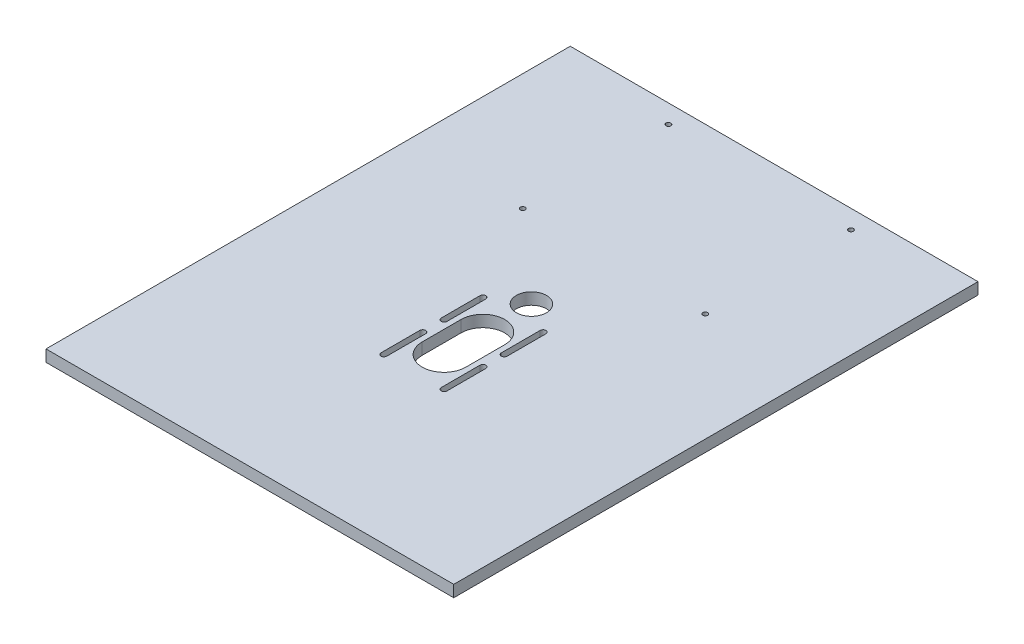
ISO-10303-21;
HEADER;
FILE_DESCRIPTION(('STEP AP214'),'2;1');
FILE_NAME('part.step','',(''),(''),'','','');
FILE_SCHEMA(('AUTOMOTIVE_DESIGN { 1 0 10303 214 1 1 1 1 }'));
ENDSEC;
DATA;
#1=APPLICATION_CONTEXT('core data for automotive mechanical design processes');
#2=APPLICATION_PROTOCOL_DEFINITION('international standard','automotive_design',2000,#1);
#3=PRODUCT_CONTEXT('',#1,'mechanical');
#4=PRODUCT('Part','Part','',(#3));
#5=PRODUCT_RELATED_PRODUCT_CATEGORY('part','',(#4));
#6=PRODUCT_DEFINITION_FORMATION('','',#4);
#7=PRODUCT_DEFINITION_CONTEXT('part definition',#1,'design');
#8=PRODUCT_DEFINITION('design','',#6,#7);
#9=PRODUCT_DEFINITION_SHAPE('','',#8);
#10=(LENGTH_UNIT() NAMED_UNIT(*) SI_UNIT(.MILLI.,.METRE.));
#11=(NAMED_UNIT(*) PLANE_ANGLE_UNIT() SI_UNIT($,.RADIAN.));
#12=(NAMED_UNIT(*) SI_UNIT($,.STERADIAN.) SOLID_ANGLE_UNIT());
#13=UNCERTAINTY_MEASURE_WITH_UNIT(LENGTH_MEASURE(1.E-05),#10,'distance_accuracy_value','');
#14=(GEOMETRIC_REPRESENTATION_CONTEXT(3) GLOBAL_UNCERTAINTY_ASSIGNED_CONTEXT((#13)) GLOBAL_UNIT_ASSIGNED_CONTEXT((#10,
#11,#12)) REPRESENTATION_CONTEXT('',''));
#15=CARTESIAN_POINT('',(0.,0.,0.));
#16=DIRECTION('',(0.,0.,1.));
#17=DIRECTION('',(1.,0.,0.));
#18=AXIS2_PLACEMENT_3D('',#15,#16,#17);
#19=CARTESIAN_POINT('',(0.,6.,0.));
#20=DIRECTION('',(0.,1.,0.));
#21=DIRECTION('',(0.,0.,1.));
#22=AXIS2_PLACEMENT_3D('',#19,#20,#21);
#23=PLANE('',#22);
#24=CARTESIAN_POINT('',(-44.8296663260453,6.,-115.382230576141));
#25=DIRECTION('',(0.,1.,0.));
#26=DIRECTION('',(0.,0.,1.));
#27=AXIS2_PLACEMENT_3D('',#24,#25,#26);
#28=CIRCLE('',#27,1.25);
#29=CARTESIAN_POINT('',(-44.8296663260453,6.,-114.132230576141));
#30=VERTEX_POINT('',#29);
#31=EDGE_CURVE('E233',#30,#30,#28,.T.);
#32=ORIENTED_EDGE('',*,*,#31,.F.);
#33=EDGE_LOOP('',(#32));
#34=FACE_BOUND('',#33,.T.);
#35=CARTESIAN_POINT('',(49.1703336739547,6.,-40.3822305761409));
#36=DIRECTION('',(0.,1.,0.));
#37=DIRECTION('',(0.,0.,1.));
#38=AXIS2_PLACEMENT_3D('',#35,#36,#37);
#39=CIRCLE('',#38,1.25);
#40=CARTESIAN_POINT('',(49.1703336739547,6.,-39.1322305761409));
#41=VERTEX_POINT('',#40);
#42=EDGE_CURVE('E545',#41,#41,#39,.T.);
#43=ORIENTED_EDGE('',*,*,#42,.F.);
#44=EDGE_LOOP('',(#43));
#45=FACE_BOUND('',#44,.T.);
#46=CARTESIAN_POINT('',(-44.8296663260453,6.,-40.3822305761409));
#47=DIRECTION('',(0.,1.,0.));
#48=DIRECTION('',(0.,0.,1.));
#49=AXIS2_PLACEMENT_3D('',#46,#47,#48);
#50=CIRCLE('',#49,1.25);
#51=CARTESIAN_POINT('',(-44.8296663260453,6.,-39.1322305761409));
#52=VERTEX_POINT('',#51);
#53=EDGE_CURVE('E525',#52,#52,#50,.T.);
#54=ORIENTED_EDGE('',*,*,#53,.F.);
#55=EDGE_LOOP('',(#54));
#56=FACE_BOUND('',#55,.T.);
#57=CARTESIAN_POINT('',(49.1703336739547,6.,-115.382230576141));
#58=DIRECTION('',(0.,1.,0.));
#59=DIRECTION('',(0.,0.,1.));
#60=AXIS2_PLACEMENT_3D('',#57,#58,#59);
#61=CIRCLE('',#60,1.25);
#62=CARTESIAN_POINT('',(49.1703336739547,6.,-114.132230576141));
#63=VERTEX_POINT('',#62);
#64=EDGE_CURVE('E541',#63,#63,#61,.T.);
#65=ORIENTED_EDGE('',*,*,#64,.F.);
#66=EDGE_LOOP('',(#65));
#67=FACE_BOUND('',#66,.T.);
#68=CARTESIAN_POINT('',(15.5000221532758,6.,60.4999999999945));
#69=DIRECTION('',(0.,1.,0.));
#70=DIRECTION('',(0.,0.,1.));
#71=AXIS2_PLACEMENT_3D('',#68,#69,#70);
#72=CIRCLE('',#71,1.49999999999999);
#73=CARTESIAN_POINT('',(14.0000221532759,6.,60.4999999999945));
#74=VERTEX_POINT('',#73);
#75=CARTESIAN_POINT('',(17.0000221532759,6.,60.4999999999945));
#76=VERTEX_POINT('',#75);
#77=EDGE_CURVE('E345',#74,#76,#72,.T.);
#78=ORIENTED_EDGE('',*,*,#77,.F.);
#79=DIRECTION('',(0.,0.,1.));
#80=VECTOR('',#79,1.);
#81=CARTESIAN_POINT('',(14.0000221532759,6.,0.));
#82=LINE('',#81,#80);
#83=CARTESIAN_POINT('',(14.0000221532759,6.,40.4999999999945));
#84=VERTEX_POINT('',#83);
#85=EDGE_CURVE('E339',#84,#74,#82,.T.);
#86=ORIENTED_EDGE('',*,*,#85,.F.);
#87=CARTESIAN_POINT('',(15.5000221532758,6.,40.4999999999945));
#88=DIRECTION('',(0.,1.,0.));
#89=DIRECTION('',(0.,0.,1.));
#90=AXIS2_PLACEMENT_3D('',#87,#88,#89);
#91=CIRCLE('',#90,1.49999999999998);
#92=CARTESIAN_POINT('',(17.0000221532759,6.,40.4999999999945));
#93=VERTEX_POINT('',#92);
#94=EDGE_CURVE('E341',#93,#84,#91,.T.);
#95=ORIENTED_EDGE('',*,*,#94,.F.);
#96=DIRECTION('',(0.,0.,-1.));
#97=VECTOR('',#96,1.);
#98=CARTESIAN_POINT('',(17.0000221532759,6.,0.));
#99=LINE('',#98,#97);
#100=EDGE_CURVE('E343',#76,#93,#99,.T.);
#101=ORIENTED_EDGE('',*,*,#100,.F.);
#102=EDGE_LOOP('',(#78,#86,#95,#101));
#103=FACE_BOUND('',#102,.T.);
#104=CARTESIAN_POINT('',(-15.4999931078622,6.,29.5000152611476));
#105=DIRECTION('',(0.,1.,0.));
#106=DIRECTION('',(0.,0.,1.));
#107=AXIS2_PLACEMENT_3D('',#104,#105,#106);
#108=CIRCLE('',#107,1.49999999999996);
#109=CARTESIAN_POINT('',(-16.9999931078615,6.,29.5000167380326));
#110=VERTEX_POINT('',#109);
#111=CARTESIAN_POINT('',(-13.999993107863,6.,29.5000137842625));
#112=VERTEX_POINT('',#111);
#113=EDGE_CURVE('E337',#110,#112,#108,.T.);
#114=ORIENTED_EDGE('',*,*,#113,.F.);
#115=DIRECTION('',(9.8459003762541E-07,0.,0.999999999999515));
#116=VECTOR('',#115,1.);
#117=CARTESIAN_POINT('',(-17.0000221532676,6.,1.67380524515267E-05));
#118=LINE('',#117,#116);
#119=CARTESIAN_POINT('',(-17.0000127996622,6.,9.50001673804232));
#120=VERTEX_POINT('',#119);
#121=EDGE_CURVE('E331',#120,#110,#118,.T.);
#122=ORIENTED_EDGE('',*,*,#121,.F.);
#123=CARTESIAN_POINT('',(-15.500012799663,6.,9.50001526115726));
#124=DIRECTION('',(0.,1.,0.));
#125=DIRECTION('',(0.,0.,1.));
#126=AXIS2_PLACEMENT_3D('',#123,#124,#125);
#127=CIRCLE('',#126,1.49999999999995);
#128=CARTESIAN_POINT('',(-14.0000127996638,6.,9.50001378427221));
#129=VERTEX_POINT('',#128);
#130=EDGE_CURVE('E333',#129,#120,#127,.T.);
#131=ORIENTED_EDGE('',*,*,#130,.F.);
#132=DIRECTION('',(-9.84590037972355E-07,0.,-0.999999999999515));
#133=VECTOR('',#132,1.);
#134=CARTESIAN_POINT('',(-14.0000221532691,6.,1.37842823435078E-05));
#135=LINE('',#134,#133);
#136=EDGE_CURVE('E335',#112,#129,#135,.T.);
#137=ORIENTED_EDGE('',*,*,#136,.F.);
#138=EDGE_LOOP('',(#114,#122,#131,#137));
#139=FACE_BOUND('',#138,.T.);
#140=CARTESIAN_POINT('',(-15.4999625855711,6.,60.5000152611325));
#141=DIRECTION('',(0.,1.,0.));
#142=DIRECTION('',(0.,0.,1.));
#143=AXIS2_PLACEMENT_3D('',#140,#141,#142);
#144=CIRCLE('',#143,1.5);
#145=CARTESIAN_POINT('',(-16.9999625855704,6.,60.5000167380176));
#146=VERTEX_POINT('',#145);
#147=CARTESIAN_POINT('',(-13.9999625855718,6.,60.5000137842475));
#148=VERTEX_POINT('',#147);
#149=EDGE_CURVE('E329',#146,#148,#144,.T.);
#150=ORIENTED_EDGE('',*,*,#149,.F.);
#151=DIRECTION('',(9.8459003762541E-07,0.,0.999999999999515));
#152=VECTOR('',#151,1.);
#153=CARTESIAN_POINT('',(-17.0000221532676,6.,1.67380524515267E-05));
#154=LINE('',#153,#152);
#155=CARTESIAN_POINT('',(-16.9999822773711,6.,40.5000167380273));
#156=VERTEX_POINT('',#155);
#157=EDGE_CURVE('E324',#156,#146,#154,.T.);
#158=ORIENTED_EDGE('',*,*,#157,.F.);
#159=CARTESIAN_POINT('',(-15.4999822773718,6.,40.5000152611422));
#160=DIRECTION('',(0.,1.,0.));
#161=DIRECTION('',(0.,0.,1.));
#162=AXIS2_PLACEMENT_3D('',#159,#160,#161);
#163=CIRCLE('',#162,1.49999999999999);
#164=CARTESIAN_POINT('',(-13.9999822773726,6.,40.5000137842572));
#165=VERTEX_POINT('',#164);
#166=EDGE_CURVE('E202',#165,#156,#163,.T.);
#167=ORIENTED_EDGE('',*,*,#166,.F.);
#168=DIRECTION('',(-9.84590037972355E-07,0.,-0.999999999999515));
#169=VECTOR('',#168,1.);
#170=CARTESIAN_POINT('',(-14.0000221532691,6.,1.37842823435077E-05));
#171=LINE('',#170,#169);
#172=EDGE_CURVE('E327',#148,#165,#171,.T.);
#173=ORIENTED_EDGE('',*,*,#172,.F.);
#174=EDGE_LOOP('',(#150,#158,#167,#173));
#175=FACE_BOUND('',#174,.T.);
#176=CARTESIAN_POINT('',(2.21532758473867E-05,6.,44.9999999999945));
#177=DIRECTION('',(0.,1.,0.));
#178=DIRECTION('',(0.,0.,1.));
#179=AXIS2_PLACEMENT_3D('',#176,#177,#178);
#180=CIRCLE('',#179,11.25);
#181=CARTESIAN_POINT('',(-11.2499778467228,6.,45.0000055383134));
#182=VERTEX_POINT('',#181);
#183=CARTESIAN_POINT('',(11.2500221532745,6.,44.9999944616755));
#184=VERTEX_POINT('',#183);
#185=EDGE_CURVE('E322',#182,#184,#180,.T.);
#186=ORIENTED_EDGE('',*,*,#185,.F.);
#187=DIRECTION('',(4.92295018552497E-07,0.,0.999999999999879));
#188=VECTOR('',#187,1.);
#189=CARTESIAN_POINT('',(-11.2499999999986,6.,5.53831895871558E-06));
#190=LINE('',#189,#188);
#191=CARTESIAN_POINT('',(-11.2499876926232,6.,25.0000055383159));
#192=VERTEX_POINT('',#191);
#193=EDGE_CURVE('E315',#192,#182,#190,.T.);
#194=ORIENTED_EDGE('',*,*,#193,.F.);
#195=CARTESIAN_POINT('',(1.23073754677155E-05,6.,24.9999999999969));
#196=DIRECTION('',(0.,1.,0.));
#197=DIRECTION('',(0.,0.,1.));
#198=AXIS2_PLACEMENT_3D('',#195,#196,#197);
#199=CIRCLE('',#198,11.25);
#200=CARTESIAN_POINT('',(11.2500123073741,6.,24.9999944616779));
#201=VERTEX_POINT('',#200);
#202=EDGE_CURVE('E317',#201,#192,#199,.T.);
#203=ORIENTED_EDGE('',*,*,#202,.F.);
#204=DIRECTION('',(-4.92295018899441E-07,0.,-0.999999999999879));
#205=VECTOR('',#204,1.);
#206=CARTESIAN_POINT('',(11.2499999999986,6.,-5.53831896261871E-06));
#207=LINE('',#206,#205);
#208=EDGE_CURVE('E320',#184,#201,#207,.T.);
#209=ORIENTED_EDGE('',*,*,#208,.F.);
#210=EDGE_LOOP('',(#186,#194,#203,#209));
#211=FACE_BOUND('',#210,.T.);
#212=CARTESIAN_POINT('',(15.5000221532758,6.,29.4999999999945));
#213=DIRECTION('',(0.,1.,0.));
#214=DIRECTION('',(0.,0.,1.));
#215=AXIS2_PLACEMENT_3D('',#212,#213,#214);
#216=CIRCLE('',#215,1.49999999999995);
#217=CARTESIAN_POINT('',(14.0000221532759,6.,29.4999999999945));
#218=VERTEX_POINT('',#217);
#219=CARTESIAN_POINT('',(17.0000221532758,6.,29.4999999999945));
#220=VERTEX_POINT('',#219);
#221=EDGE_CURVE('E313',#218,#220,#216,.T.);
#222=ORIENTED_EDGE('',*,*,#221,.F.);
#223=DIRECTION('',(0.,0.,1.));
#224=VECTOR('',#223,1.);
#225=CARTESIAN_POINT('',(14.0000221532759,6.,0.));
#226=LINE('',#225,#224);
#227=CARTESIAN_POINT('',(14.0000221532759,6.,9.49999999999447));
#228=VERTEX_POINT('',#227);
#229=EDGE_CURVE('E300',#228,#218,#226,.T.);
#230=ORIENTED_EDGE('',*,*,#229,.F.);
#231=CARTESIAN_POINT('',(15.5000221532758,6.,9.49999999999448));
#232=DIRECTION('',(0.,1.,0.));
#233=DIRECTION('',(0.,0.,1.));
#234=AXIS2_PLACEMENT_3D('',#231,#232,#233);
#235=CIRCLE('',#234,1.49999999999994);
#236=CARTESIAN_POINT('',(17.0000221532758,6.,9.49999999999448));
#237=VERTEX_POINT('',#236);
#238=EDGE_CURVE('E308',#237,#228,#235,.T.);
#239=ORIENTED_EDGE('',*,*,#238,.F.);
#240=DIRECTION('',(0.,0.,-1.));
#241=VECTOR('',#240,1.);
#242=CARTESIAN_POINT('',(17.0000221532758,6.,0.));
#243=LINE('',#242,#241);
#244=EDGE_CURVE('E311',#220,#237,#243,.T.);
#245=ORIENTED_EDGE('',*,*,#244,.F.);
#246=EDGE_LOOP('',(#222,#230,#239,#245));
#247=FACE_BOUND('',#246,.T.);
#248=DIRECTION('',(0.,0.,1.));
#249=VECTOR('',#248,1.);
#250=CARTESIAN_POINT('',(-105.,6.,-125.));
#251=LINE('',#250,#249);
#252=CARTESIAN_POINT('',(-105.,6.,-125.));
#253=VERTEX_POINT('',#252);
#254=CARTESIAN_POINT('',(-105.,6.,145.));
#255=VERTEX_POINT('',#254);
#256=EDGE_CURVE('E354',#253,#255,#251,.T.);
#257=ORIENTED_EDGE('',*,*,#256,.T.);
#258=DIRECTION('',(1.,0.,0.));
#259=VECTOR('',#258,1.);
#260=CARTESIAN_POINT('',(-105.,6.,145.));
#261=LINE('',#260,#259);
#262=CARTESIAN_POINT('',(105.,6.,145.));
#263=VERTEX_POINT('',#262);
#264=EDGE_CURVE('E357',#255,#263,#261,.T.);
#265=ORIENTED_EDGE('',*,*,#264,.T.);
#266=DIRECTION('',(0.,0.,-1.));
#267=VECTOR('',#266,1.);
#268=CARTESIAN_POINT('',(105.,6.,145.));
#269=LINE('',#268,#267);
#270=CARTESIAN_POINT('',(105.,6.,-125.));
#271=VERTEX_POINT('',#270);
#272=EDGE_CURVE('E360',#263,#271,#269,.T.);
#273=ORIENTED_EDGE('',*,*,#272,.T.);
#274=DIRECTION('',(-1.,0.,0.));
#275=VECTOR('',#274,1.);
#276=CARTESIAN_POINT('',(105.,6.,-125.));
#277=LINE('',#276,#275);
#278=EDGE_CURVE('E362',#271,#253,#277,.T.);
#279=ORIENTED_EDGE('',*,*,#278,.T.);
#280=EDGE_LOOP('',(#257,#265,#273,#279));
#281=FACE_BOUND('',#280,.T.);
#282=CARTESIAN_POINT('',(0.,6.,0.));
#283=DIRECTION('',(0.,1.,0.));
#284=DIRECTION('',(0.,0.,1.));
#285=AXIS2_PLACEMENT_3D('',#282,#283,#284);
#286=CIRCLE('',#285,7.75);
#287=CARTESIAN_POINT('',(0.,6.,7.75));
#288=VERTEX_POINT('',#287);
#289=EDGE_CURVE('E348',#288,#288,#286,.T.);
#290=ORIENTED_EDGE('',*,*,#289,.F.);
#291=EDGE_LOOP('',(#290));
#292=FACE_BOUND('',#291,.T.);
#293=ADVANCED_FACE('F33',(#34,#45,#56,#67,#103,#139,#175,#211,#247,#281,#292),#23,.T.);
#294=CARTESIAN_POINT('',(0.,0.,0.));
#295=DIRECTION('',(0.,1.,0.));
#296=DIRECTION('',(0.,0.,1.));
#297=AXIS2_PLACEMENT_3D('',#294,#295,#296);
#298=PLANE('',#297);
#299=CARTESIAN_POINT('',(-44.8296663260453,0.,-115.382230576141));
#300=DIRECTION('',(0.,-1.,0.));
#301=DIRECTION('',(0.,0.,-1.));
#302=AXIS2_PLACEMENT_3D('',#299,#300,#301);
#303=CIRCLE('',#302,1.25);
#304=CARTESIAN_POINT('',(-44.8296663260453,0.,-116.632230576141));
#305=VERTEX_POINT('',#304);
#306=EDGE_CURVE('E533',#305,#305,#303,.T.);
#307=ORIENTED_EDGE('',*,*,#306,.F.);
#308=EDGE_LOOP('',(#307));
#309=FACE_BOUND('',#308,.T.);
#310=CARTESIAN_POINT('',(49.1703336739547,0.,-40.3822305761409));
#311=DIRECTION('',(0.,-1.,0.));
#312=DIRECTION('',(0.,0.,-1.));
#313=AXIS2_PLACEMENT_3D('',#310,#311,#312);
#314=CIRCLE('',#313,1.25);
#315=CARTESIAN_POINT('',(49.1703336739547,0.,-41.6322305761409));
#316=VERTEX_POINT('',#315);
#317=EDGE_CURVE('E530',#316,#316,#314,.T.);
#318=ORIENTED_EDGE('',*,*,#317,.F.);
#319=EDGE_LOOP('',(#318));
#320=FACE_BOUND('',#319,.T.);
#321=CARTESIAN_POINT('',(-44.8296663260453,0.,-40.3822305761409));
#322=DIRECTION('',(0.,-1.,0.));
#323=DIRECTION('',(0.,0.,-1.));
#324=AXIS2_PLACEMENT_3D('',#321,#322,#323);
#325=CIRCLE('',#324,1.25);
#326=CARTESIAN_POINT('',(-44.8296663260453,0.,-41.6322305761409));
#327=VERTEX_POINT('',#326);
#328=EDGE_CURVE('E528',#327,#327,#325,.T.);
#329=ORIENTED_EDGE('',*,*,#328,.F.);
#330=EDGE_LOOP('',(#329));
#331=FACE_BOUND('',#330,.T.);
#332=CARTESIAN_POINT('',(49.1703336739547,0.,-115.382230576141));
#333=DIRECTION('',(0.,-1.,0.));
#334=DIRECTION('',(0.,0.,-1.));
#335=AXIS2_PLACEMENT_3D('',#332,#333,#334);
#336=CIRCLE('',#335,1.25);
#337=CARTESIAN_POINT('',(49.1703336739547,0.,-116.632230576141));
#338=VERTEX_POINT('',#337);
#339=EDGE_CURVE('E537',#338,#338,#336,.T.);
#340=ORIENTED_EDGE('',*,*,#339,.F.);
#341=EDGE_LOOP('',(#340));
#342=FACE_BOUND('',#341,.T.);
#343=DIRECTION('',(0.,0.,-1.));
#344=VECTOR('',#343,1.);
#345=CARTESIAN_POINT('',(14.0000221532759,0.,60.4999999999945));
#346=LINE('',#345,#344);
#347=CARTESIAN_POINT('',(14.0000221532759,0.,60.4999999999945));
#348=VERTEX_POINT('',#347);
#349=CARTESIAN_POINT('',(14.0000221532759,0.,40.4999999999945));
#350=VERTEX_POINT('',#349);
#351=EDGE_CURVE('E253',#348,#350,#346,.T.);
#352=ORIENTED_EDGE('',*,*,#351,.F.);
#353=CARTESIAN_POINT('',(15.5000221532758,0.,60.4999999999945));
#354=DIRECTION('',(0.,-1.,0.));
#355=DIRECTION('',(0.,0.,-1.));
#356=AXIS2_PLACEMENT_3D('',#353,#354,#355);
#357=CIRCLE('',#356,1.49999999999999);
#358=CARTESIAN_POINT('',(17.0000221532759,0.,60.4999999999945));
#359=VERTEX_POINT('',#358);
#360=EDGE_CURVE('E251',#359,#348,#357,.T.);
#361=ORIENTED_EDGE('',*,*,#360,.F.);
#362=DIRECTION('',(0.,0.,1.));
#363=VECTOR('',#362,1.);
#364=CARTESIAN_POINT('',(17.0000221532759,0.,60.4999999999945));
#365=LINE('',#364,#363);
#366=CARTESIAN_POINT('',(17.0000221532759,0.,40.4999999999945));
#367=VERTEX_POINT('',#366);
#368=EDGE_CURVE('E259',#367,#359,#365,.T.);
#369=ORIENTED_EDGE('',*,*,#368,.F.);
#370=CARTESIAN_POINT('',(15.5000221532758,0.,40.4999999999945));
#371=DIRECTION('',(0.,-1.,0.));
#372=DIRECTION('',(0.,0.,-1.));
#373=AXIS2_PLACEMENT_3D('',#370,#371,#372);
#374=CIRCLE('',#373,1.49999999999998);
#375=EDGE_CURVE('E256',#350,#367,#374,.T.);
#376=ORIENTED_EDGE('',*,*,#375,.F.);
#377=EDGE_LOOP('',(#352,#361,#369,#376));
#378=FACE_BOUND('',#377,.T.);
#379=DIRECTION('',(-9.8459003762541E-07,0.,-0.999999999999515));
#380=VECTOR('',#379,1.);
#381=CARTESIAN_POINT('',(-16.9999931078615,0.,29.5000167380326));
#382=LINE('',#381,#380);
#383=CARTESIAN_POINT('',(-16.9999931078615,0.,29.5000167380326));
#384=VERTEX_POINT('',#383);
#385=CARTESIAN_POINT('',(-17.0000127996622,0.,9.50001673804232));
#386=VERTEX_POINT('',#385);
#387=EDGE_CURVE('E272',#384,#386,#382,.T.);
#388=ORIENTED_EDGE('',*,*,#387,.F.);
#389=CARTESIAN_POINT('',(-15.4999931078622,0.,29.5000152611476));
#390=DIRECTION('',(0.,-1.,0.));
#391=DIRECTION('',(0.,0.,1.));
#392=AXIS2_PLACEMENT_3D('',#389,#390,#391);
#393=CIRCLE('',#392,1.49999999999996);
#394=CARTESIAN_POINT('',(-13.999993107863,0.,29.5000137842625));
#395=VERTEX_POINT('',#394);
#396=EDGE_CURVE('E227',#395,#384,#393,.T.);
#397=ORIENTED_EDGE('',*,*,#396,.F.);
#398=DIRECTION('',(9.84590037972355E-07,0.,0.999999999999515));
#399=VECTOR('',#398,1.);
#400=CARTESIAN_POINT('',(-13.999993107863,0.,29.5000137842625));
#401=LINE('',#400,#399);
#402=CARTESIAN_POINT('',(-14.0000127996638,0.,9.50001378427221));
#403=VERTEX_POINT('',#402);
#404=EDGE_CURVE('E277',#403,#395,#401,.T.);
#405=ORIENTED_EDGE('',*,*,#404,.F.);
#406=CARTESIAN_POINT('',(-15.500012799663,0.,9.50001526115726));
#407=DIRECTION('',(0.,-1.,0.));
#408=DIRECTION('',(0.,0.,1.));
#409=AXIS2_PLACEMENT_3D('',#406,#407,#408);
#410=CIRCLE('',#409,1.49999999999995);
#411=EDGE_CURVE('E274',#386,#403,#410,.T.);
#412=ORIENTED_EDGE('',*,*,#411,.F.);
#413=EDGE_LOOP('',(#388,#397,#405,#412));
#414=FACE_BOUND('',#413,.T.);
#415=DIRECTION('',(-9.8459003762541E-07,0.,-0.999999999999515));
#416=VECTOR('',#415,1.);
#417=CARTESIAN_POINT('',(-16.9999625855704,0.,60.5000167380176));
#418=LINE('',#417,#416);
#419=CARTESIAN_POINT('',(-16.9999625855704,0.,60.5000167380176));
#420=VERTEX_POINT('',#419);
#421=CARTESIAN_POINT('',(-16.9999822773711,0.,40.5000167380273));
#422=VERTEX_POINT('',#421);
#423=EDGE_CURVE('E210',#420,#422,#418,.T.);
#424=ORIENTED_EDGE('',*,*,#423,.F.);
#425=CARTESIAN_POINT('',(-15.4999625855711,0.,60.5000152611325));
#426=DIRECTION('',(0.,-1.,0.));
#427=DIRECTION('',(0.,0.,1.));
#428=AXIS2_PLACEMENT_3D('',#425,#426,#427);
#429=CIRCLE('',#428,1.5);
#430=CARTESIAN_POINT('',(-13.9999625855718,0.,60.5000137842475));
#431=VERTEX_POINT('',#430);
#432=EDGE_CURVE('E215',#431,#420,#429,.T.);
#433=ORIENTED_EDGE('',*,*,#432,.F.);
#434=DIRECTION('',(9.84590037972355E-07,0.,0.999999999999515));
#435=VECTOR('',#434,1.);
#436=CARTESIAN_POINT('',(-13.9999625855718,0.,60.5000137842475));
#437=LINE('',#436,#435);
#438=CARTESIAN_POINT('',(-13.9999822773726,0.,40.5000137842572));
#439=VERTEX_POINT('',#438);
#440=EDGE_CURVE('E220',#439,#431,#437,.T.);
#441=ORIENTED_EDGE('',*,*,#440,.F.);
#442=CARTESIAN_POINT('',(-15.4999822773718,0.,40.5000152611422));
#443=DIRECTION('',(0.,-1.,0.));
#444=DIRECTION('',(0.,0.,1.));
#445=AXIS2_PLACEMENT_3D('',#442,#443,#444);
#446=CIRCLE('',#445,1.49999999999999);
#447=EDGE_CURVE('E199',#422,#439,#446,.T.);
#448=ORIENTED_EDGE('',*,*,#447,.F.);
#449=EDGE_LOOP('',(#424,#433,#441,#448));
#450=FACE_BOUND('',#449,.T.);
#451=DIRECTION('',(-4.92295018552497E-07,0.,-0.999999999999879));
#452=VECTOR('',#451,1.);
#453=CARTESIAN_POINT('',(-11.2499778467228,0.,45.0000055383134));
#454=LINE('',#453,#452);
#455=CARTESIAN_POINT('',(-11.2499778467228,0.,45.0000055383134));
#456=VERTEX_POINT('',#455);
#457=CARTESIAN_POINT('',(-11.2499876926232,0.,25.0000055383159));
#458=VERTEX_POINT('',#457);
#459=EDGE_CURVE('E232',#456,#458,#454,.T.);
#460=ORIENTED_EDGE('',*,*,#459,.F.);
#461=CARTESIAN_POINT('',(2.21532758473867E-05,0.,44.9999999999945));
#462=DIRECTION('',(0.,-1.,0.));
#463=DIRECTION('',(0.,0.,-1.));
#464=AXIS2_PLACEMENT_3D('',#461,#462,#463);
#465=CIRCLE('',#464,11.25);
#466=CARTESIAN_POINT('',(11.2500221532745,0.,44.9999944616755));
#467=VERTEX_POINT('',#466);
#468=EDGE_CURVE('E230',#467,#456,#465,.T.);
#469=ORIENTED_EDGE('',*,*,#468,.F.);
#470=DIRECTION('',(4.92295018899441E-07,0.,0.999999999999879));
#471=VECTOR('',#470,1.);
#472=CARTESIAN_POINT('',(11.2500221532745,0.,44.9999944616755));
#473=LINE('',#472,#471);
#474=CARTESIAN_POINT('',(11.2500123073741,0.,24.9999944616779));
#475=VERTEX_POINT('',#474);
#476=EDGE_CURVE('E239',#475,#467,#473,.T.);
#477=ORIENTED_EDGE('',*,*,#476,.F.);
#478=CARTESIAN_POINT('',(1.23073754677155E-05,0.,24.9999999999969));
#479=DIRECTION('',(0.,-1.,0.));
#480=DIRECTION('',(0.,0.,-1.));
#481=AXIS2_PLACEMENT_3D('',#478,#479,#480);
#482=CIRCLE('',#481,11.25);
#483=EDGE_CURVE('E236',#458,#475,#482,.T.);
#484=ORIENTED_EDGE('',*,*,#483,.F.);
#485=EDGE_LOOP('',(#460,#469,#477,#484));
#486=FACE_BOUND('',#485,.T.);
#487=DIRECTION('',(0.,0.,-1.));
#488=VECTOR('',#487,1.);
#489=CARTESIAN_POINT('',(14.0000221532759,0.,29.4999999999945));
#490=LINE('',#489,#488);
#491=CARTESIAN_POINT('',(14.0000221532759,0.,29.4999999999945));
#492=VERTEX_POINT('',#491);
#493=CARTESIAN_POINT('',(14.0000221532759,0.,9.49999999999447));
#494=VERTEX_POINT('',#493);
#495=EDGE_CURVE('E288',#492,#494,#490,.T.);
#496=ORIENTED_EDGE('',*,*,#495,.F.);
#497=CARTESIAN_POINT('',(15.5000221532758,0.,29.4999999999945));
#498=DIRECTION('',(0.,-1.,0.));
#499=DIRECTION('',(0.,0.,-1.));
#500=AXIS2_PLACEMENT_3D('',#497,#498,#499);
#501=CIRCLE('',#500,1.49999999999995);
#502=CARTESIAN_POINT('',(17.0000221532758,0.,29.4999999999945));
#503=VERTEX_POINT('',#502);
#504=EDGE_CURVE('E265',#503,#492,#501,.T.);
#505=ORIENTED_EDGE('',*,*,#504,.F.);
#506=DIRECTION('',(0.,0.,1.));
#507=VECTOR('',#506,1.);
#508=CARTESIAN_POINT('',(17.0000221532758,0.,29.4999999999945));
#509=LINE('',#508,#507);
#510=CARTESIAN_POINT('',(17.0000221532758,0.,9.49999999999448));
#511=VERTEX_POINT('',#510);
#512=EDGE_CURVE('E294',#511,#503,#509,.T.);
#513=ORIENTED_EDGE('',*,*,#512,.F.);
#514=CARTESIAN_POINT('',(15.5000221532758,0.,9.49999999999448));
#515=DIRECTION('',(0.,-1.,0.));
#516=DIRECTION('',(0.,0.,-1.));
#517=AXIS2_PLACEMENT_3D('',#514,#515,#516);
#518=CIRCLE('',#517,1.49999999999994);
#519=EDGE_CURVE('E291',#494,#511,#518,.T.);
#520=ORIENTED_EDGE('',*,*,#519,.F.);
#521=EDGE_LOOP('',(#496,#505,#513,#520));
#522=FACE_BOUND('',#521,.T.);
#523=DIRECTION('',(0.,0.,1.));
#524=VECTOR('',#523,1.);
#525=CARTESIAN_POINT('',(-105.,0.,-125.));
#526=LINE('',#525,#524);
#527=CARTESIAN_POINT('',(-105.,0.,-125.));
#528=VERTEX_POINT('',#527);
#529=CARTESIAN_POINT('',(-105.,0.,145.));
#530=VERTEX_POINT('',#529);
#531=EDGE_CURVE('E351',#528,#530,#526,.T.);
#532=ORIENTED_EDGE('',*,*,#531,.F.);
#533=DIRECTION('',(-1.,0.,0.));
#534=VECTOR('',#533,1.);
#535=CARTESIAN_POINT('',(105.,0.,-125.));
#536=LINE('',#535,#534);
#537=CARTESIAN_POINT('',(105.,0.,-125.));
#538=VERTEX_POINT('',#537);
#539=EDGE_CURVE('E358',#538,#528,#536,.T.);
#540=ORIENTED_EDGE('',*,*,#539,.F.);
#541=DIRECTION('',(0.,0.,-1.));
#542=VECTOR('',#541,1.);
#543=CARTESIAN_POINT('',(105.,0.,145.));
#544=LINE('',#543,#542);
#545=CARTESIAN_POINT('',(105.,0.,145.));
#546=VERTEX_POINT('',#545);
#547=EDGE_CURVE('E369',#546,#538,#544,.T.);
#548=ORIENTED_EDGE('',*,*,#547,.F.);
#549=DIRECTION('',(1.,0.,0.));
#550=VECTOR('',#549,1.);
#551=CARTESIAN_POINT('',(-105.,0.,145.));
#552=LINE('',#551,#550);
#553=EDGE_CURVE('E367',#530,#546,#552,.T.);
#554=ORIENTED_EDGE('',*,*,#553,.F.);
#555=EDGE_LOOP('',(#532,#540,#548,#554));
#556=FACE_BOUND('',#555,.T.);
#557=CARTESIAN_POINT('',(0.,0.,0.));
#558=DIRECTION('',(0.,1.,0.));
#559=DIRECTION('',(0.,0.,1.));
#560=AXIS2_PLACEMENT_3D('',#557,#558,#559);
#561=CIRCLE('',#560,7.75);
#562=CARTESIAN_POINT('',(0.,0.,7.75));
#563=VERTEX_POINT('',#562);
#564=EDGE_CURVE('E347',#563,#563,#561,.T.);
#565=ORIENTED_EDGE('',*,*,#564,.T.);
#566=EDGE_LOOP('',(#565));
#567=FACE_BOUND('',#566,.T.);
#568=ADVANCED_FACE('F217',(#309,#320,#331,#342,#378,#414,#450,#486,#522,#556,#567),#298,.F.);
#569=CARTESIAN_POINT('',(-105.,6.,-125.));
#570=DIRECTION('',(1.,0.,0.));
#571=DIRECTION('',(0.,0.,-1.));
#572=AXIS2_PLACEMENT_3D('',#569,#570,#571);
#573=PLANE('',#572);
#574=ORIENTED_EDGE('',*,*,#531,.T.);
#575=DIRECTION('',(0.,-1.,0.));
#576=VECTOR('',#575,1.);
#577=CARTESIAN_POINT('',(-105.,6.,145.));
#578=LINE('',#577,#576);
#579=EDGE_CURVE('E11',#255,#530,#578,.T.);
#580=ORIENTED_EDGE('',*,*,#579,.F.);
#581=ORIENTED_EDGE('',*,*,#256,.F.);
#582=DIRECTION('',(0.,-1.,0.));
#583=VECTOR('',#582,1.);
#584=CARTESIAN_POINT('',(-105.,6.,-125.));
#585=LINE('',#584,#583);
#586=EDGE_CURVE('E364',#253,#528,#585,.T.);
#587=ORIENTED_EDGE('',*,*,#586,.T.);
#588=EDGE_LOOP('',(#574,#580,#581,#587));
#589=FACE_BOUND('',#588,.T.);
#590=ADVANCED_FACE('F35',(#589),#573,.F.);
#591=CARTESIAN_POINT('',(-105.,6.,145.));
#592=DIRECTION('',(0.,0.,-1.));
#593=DIRECTION('',(-1.,0.,0.));
#594=AXIS2_PLACEMENT_3D('',#591,#592,#593);
#595=PLANE('',#594);
#596=ORIENTED_EDGE('',*,*,#553,.T.);
#597=DIRECTION('',(0.,-1.,0.));
#598=VECTOR('',#597,1.);
#599=CARTESIAN_POINT('',(105.,6.,145.));
#600=LINE('',#599,#598);
#601=EDGE_CURVE('E41',#263,#546,#600,.T.);
#602=ORIENTED_EDGE('',*,*,#601,.F.);
#603=ORIENTED_EDGE('',*,*,#264,.F.);
#604=ORIENTED_EDGE('',*,*,#579,.T.);
#605=EDGE_LOOP('',(#596,#602,#603,#604));
#606=FACE_BOUND('',#605,.T.);
#607=ADVANCED_FACE('F397',(#606),#595,.F.);
#608=CARTESIAN_POINT('',(105.,6.,145.));
#609=DIRECTION('',(-1.,0.,0.));
#610=DIRECTION('',(0.,0.,1.));
#611=AXIS2_PLACEMENT_3D('',#608,#609,#610);
#612=PLANE('',#611);
#613=ORIENTED_EDGE('',*,*,#547,.T.);
#614=DIRECTION('',(0.,-1.,0.));
#615=VECTOR('',#614,1.);
#616=CARTESIAN_POINT('',(105.,6.,-125.));
#617=LINE('',#616,#615);
#618=EDGE_CURVE('E374',#271,#538,#617,.T.);
#619=ORIENTED_EDGE('',*,*,#618,.F.);
#620=ORIENTED_EDGE('',*,*,#272,.F.);
#621=ORIENTED_EDGE('',*,*,#601,.T.);
#622=EDGE_LOOP('',(#613,#619,#620,#621));
#623=FACE_BOUND('',#622,.T.);
#624=ADVANCED_FACE('F381',(#623),#612,.F.);
#625=CARTESIAN_POINT('',(105.,6.,-125.));
#626=DIRECTION('',(0.,0.,1.));
#627=DIRECTION('',(1.,0.,0.));
#628=AXIS2_PLACEMENT_3D('',#625,#626,#627);
#629=PLANE('',#628);
#630=ORIENTED_EDGE('',*,*,#539,.T.);
#631=ORIENTED_EDGE('',*,*,#586,.F.);
#632=ORIENTED_EDGE('',*,*,#278,.F.);
#633=ORIENTED_EDGE('',*,*,#618,.T.);
#634=EDGE_LOOP('',(#630,#631,#632,#633));
#635=FACE_BOUND('',#634,.T.);
#636=ADVANCED_FACE('F390',(#635),#629,.F.);
#637=CARTESIAN_POINT('',(0.,6.,0.));
#638=DIRECTION('',(0.,-1.,0.));
#639=DIRECTION('',(0.,0.,-1.));
#640=AXIS2_PLACEMENT_3D('',#637,#638,#639);
#641=CYLINDRICAL_SURFACE('',#640,7.75);
#642=ORIENTED_EDGE('',*,*,#289,.T.);
#643=EDGE_LOOP('',(#642));
#644=FACE_BOUND('',#643,.T.);
#645=ORIENTED_EDGE('',*,*,#564,.F.);
#646=EDGE_LOOP('',(#645));
#647=FACE_BOUND('',#646,.T.);
#648=ADVANCED_FACE('F416',(#644,#647),#641,.F.);
#649=CARTESIAN_POINT('',(15.5000221532758,10.,29.4999999999945));
#650=DIRECTION('',(0.,-1.,0.));
#651=DIRECTION('',(0.,0.,-1.));
#652=AXIS2_PLACEMENT_3D('',#649,#650,#651);
#653=CYLINDRICAL_SURFACE('',#652,1.49999999999995);
#654=ORIENTED_EDGE('',*,*,#221,.T.);
#655=DIRECTION('',(0.,-1.,0.));
#656=VECTOR('',#655,1.);
#657=CARTESIAN_POINT('',(17.0000221532758,10.,29.4999999999945));
#658=LINE('',#657,#656);
#659=EDGE_CURVE('E298',#220,#503,#658,.T.);
#660=ORIENTED_EDGE('',*,*,#659,.T.);
#661=ORIENTED_EDGE('',*,*,#504,.T.);
#662=DIRECTION('',(0.,-1.,0.));
#663=VECTOR('',#662,1.);
#664=CARTESIAN_POINT('',(14.0000221532759,10.,29.4999999999945));
#665=LINE('',#664,#663);
#666=EDGE_CURVE('E297',#218,#492,#665,.T.);
#667=ORIENTED_EDGE('',*,*,#666,.F.);
#668=EDGE_LOOP('',(#654,#660,#661,#667));
#669=FACE_BOUND('',#668,.T.);
#670=ADVANCED_FACE('F423',(#669),#653,.F.);
#671=CARTESIAN_POINT('',(17.0000221532758,10.,29.4999999999945));
#672=DIRECTION('',(1.,0.,0.));
#673=DIRECTION('',(0.,0.,-1.));
#674=AXIS2_PLACEMENT_3D('',#671,#672,#673);
#675=PLANE('',#674);
#676=ORIENTED_EDGE('',*,*,#244,.T.);
#677=DIRECTION('',(0.,-1.,0.));
#678=VECTOR('',#677,1.);
#679=CARTESIAN_POINT('',(17.0000221532758,10.,9.49999999999448));
#680=LINE('',#679,#678);
#681=EDGE_CURVE('E301',#237,#511,#680,.T.);
#682=ORIENTED_EDGE('',*,*,#681,.T.);
#683=ORIENTED_EDGE('',*,*,#512,.T.);
#684=ORIENTED_EDGE('',*,*,#659,.F.);
#685=EDGE_LOOP('',(#676,#682,#683,#684));
#686=FACE_BOUND('',#685,.T.);
#687=ADVANCED_FACE('F428',(#686),#675,.F.);
#688=CARTESIAN_POINT('',(15.5000221532758,10.,9.49999999999448));
#689=DIRECTION('',(0.,-1.,0.));
#690=DIRECTION('',(0.,0.,-1.));
#691=AXIS2_PLACEMENT_3D('',#688,#689,#690);
#692=CYLINDRICAL_SURFACE('',#691,1.49999999999994);
#693=ORIENTED_EDGE('',*,*,#238,.T.);
#694=DIRECTION('',(0.,-1.,0.));
#695=VECTOR('',#694,1.);
#696=CARTESIAN_POINT('',(14.0000221532759,10.,9.49999999999447));
#697=LINE('',#696,#695);
#698=EDGE_CURVE('E303',#228,#494,#697,.T.);
#699=ORIENTED_EDGE('',*,*,#698,.T.);
#700=ORIENTED_EDGE('',*,*,#519,.T.);
#701=ORIENTED_EDGE('',*,*,#681,.F.);
#702=EDGE_LOOP('',(#693,#699,#700,#701));
#703=FACE_BOUND('',#702,.T.);
#704=ADVANCED_FACE('F436',(#703),#692,.F.);
#705=CARTESIAN_POINT('',(14.0000221532759,10.,29.4999999999945));
#706=DIRECTION('',(-1.,0.,0.));
#707=DIRECTION('',(0.,0.,1.));
#708=AXIS2_PLACEMENT_3D('',#705,#706,#707);
#709=PLANE('',#708);
#710=ORIENTED_EDGE('',*,*,#229,.T.);
#711=ORIENTED_EDGE('',*,*,#666,.T.);
#712=ORIENTED_EDGE('',*,*,#495,.T.);
#713=ORIENTED_EDGE('',*,*,#698,.F.);
#714=EDGE_LOOP('',(#710,#711,#712,#713));
#715=FACE_BOUND('',#714,.T.);
#716=ADVANCED_FACE('F440',(#715),#709,.F.);
#717=CARTESIAN_POINT('',(2.21532758473867E-05,10.,44.9999999999945));
#718=DIRECTION('',(0.,-1.,0.));
#719=DIRECTION('',(0.,0.,-1.));
#720=AXIS2_PLACEMENT_3D('',#717,#718,#719);
#721=CYLINDRICAL_SURFACE('',#720,11.25);
#722=ORIENTED_EDGE('',*,*,#185,.T.);
#723=DIRECTION('',(0.,-1.,0.));
#724=VECTOR('',#723,1.);
#725=CARTESIAN_POINT('',(11.2500221532745,10.,44.9999944616755));
#726=LINE('',#725,#724);
#727=EDGE_CURVE('E243',#184,#467,#726,.T.);
#728=ORIENTED_EDGE('',*,*,#727,.T.);
#729=ORIENTED_EDGE('',*,*,#468,.T.);
#730=DIRECTION('',(0.,-1.,0.));
#731=VECTOR('',#730,1.);
#732=CARTESIAN_POINT('',(-11.2499778467228,10.,45.0000055383134));
#733=LINE('',#732,#731);
#734=EDGE_CURVE('E242',#182,#456,#733,.T.);
#735=ORIENTED_EDGE('',*,*,#734,.F.);
#736=EDGE_LOOP('',(#722,#728,#729,#735));
#737=FACE_BOUND('',#736,.T.);
#738=ADVANCED_FACE('F443',(#737),#721,.F.);
#739=CARTESIAN_POINT('',(11.2500221532745,10.,44.9999944616755));
#740=DIRECTION('',(0.999999999999879,0.,-4.92295018899441E-07));
#741=DIRECTION('',(-4.92295018899441E-07,0.,-0.999999999999879));
#742=AXIS2_PLACEMENT_3D('',#739,#740,#741);
#743=PLANE('',#742);
#744=ORIENTED_EDGE('',*,*,#208,.T.);
#745=DIRECTION('',(0.,-1.,0.));
#746=VECTOR('',#745,1.);
#747=CARTESIAN_POINT('',(11.2500123073741,10.,24.9999944616779));
#748=LINE('',#747,#746);
#749=EDGE_CURVE('E245',#201,#475,#748,.T.);
#750=ORIENTED_EDGE('',*,*,#749,.T.);
#751=ORIENTED_EDGE('',*,*,#476,.T.);
#752=ORIENTED_EDGE('',*,*,#727,.F.);
#753=EDGE_LOOP('',(#744,#750,#751,#752));
#754=FACE_BOUND('',#753,.T.);
#755=ADVANCED_FACE('F481',(#754),#743,.F.);
#756=CARTESIAN_POINT('',(1.23073754677155E-05,10.,24.9999999999969));
#757=DIRECTION('',(0.,-1.,0.));
#758=DIRECTION('',(0.,0.,-1.));
#759=AXIS2_PLACEMENT_3D('',#756,#757,#758);
#760=CYLINDRICAL_SURFACE('',#759,11.25);
#761=ORIENTED_EDGE('',*,*,#202,.T.);
#762=DIRECTION('',(0.,-1.,0.));
#763=VECTOR('',#762,1.);
#764=CARTESIAN_POINT('',(-11.2499876926232,10.,25.0000055383159));
#765=LINE('',#764,#763);
#766=EDGE_CURVE('E247',#192,#458,#765,.T.);
#767=ORIENTED_EDGE('',*,*,#766,.T.);
#768=ORIENTED_EDGE('',*,*,#483,.T.);
#769=ORIENTED_EDGE('',*,*,#749,.F.);
#770=EDGE_LOOP('',(#761,#767,#768,#769));
#771=FACE_BOUND('',#770,.T.);
#772=ADVANCED_FACE('F487',(#771),#760,.F.);
#773=CARTESIAN_POINT('',(-11.2499778467228,10.,45.0000055383134));
#774=DIRECTION('',(-0.999999999999879,0.,4.92295018552497E-07));
#775=DIRECTION('',(4.92295018552497E-07,0.,0.999999999999879));
#776=AXIS2_PLACEMENT_3D('',#773,#774,#775);
#777=PLANE('',#776);
#778=ORIENTED_EDGE('',*,*,#193,.T.);
#779=ORIENTED_EDGE('',*,*,#734,.T.);
#780=ORIENTED_EDGE('',*,*,#459,.T.);
#781=ORIENTED_EDGE('',*,*,#766,.F.);
#782=EDGE_LOOP('',(#778,#779,#780,#781));
#783=FACE_BOUND('',#782,.T.);
#784=ADVANCED_FACE('F483',(#783),#777,.F.);
#785=CARTESIAN_POINT('',(-15.4999625855711,10.,60.5000152611325));
#786=DIRECTION('',(0.,-1.,0.));
#787=DIRECTION('',(0.,0.,-1.));
#788=AXIS2_PLACEMENT_3D('',#785,#786,#787);
#789=CYLINDRICAL_SURFACE('',#788,1.5);
#790=ORIENTED_EDGE('',*,*,#149,.T.);
#791=DIRECTION('',(0.,-1.,0.));
#792=VECTOR('',#791,1.);
#793=CARTESIAN_POINT('',(-13.9999625855718,10.,60.5000137842475));
#794=LINE('',#793,#792);
#795=EDGE_CURVE('E225',#148,#431,#794,.T.);
#796=ORIENTED_EDGE('',*,*,#795,.T.);
#797=ORIENTED_EDGE('',*,*,#432,.T.);
#798=DIRECTION('',(0.,-1.,0.));
#799=VECTOR('',#798,1.);
#800=CARTESIAN_POINT('',(-16.9999625855704,10.,60.5000167380176));
#801=LINE('',#800,#799);
#802=EDGE_CURVE('E206',#146,#420,#801,.T.);
#803=ORIENTED_EDGE('',*,*,#802,.F.);
#804=EDGE_LOOP('',(#790,#796,#797,#803));
#805=FACE_BOUND('',#804,.T.);
#806=ADVANCED_FACE('F486',(#805),#789,.F.);
#807=CARTESIAN_POINT('',(-13.9999625855718,10.,60.5000137842475));
#808=DIRECTION('',(0.999999999999515,0.,-9.84590037972355E-07));
#809=DIRECTION('',(-9.84590037972355E-07,0.,-0.999999999999515));
#810=AXIS2_PLACEMENT_3D('',#807,#808,#809);
#811=PLANE('',#810);
#812=ORIENTED_EDGE('',*,*,#172,.T.);
#813=DIRECTION('',(0.,-1.,0.));
#814=VECTOR('',#813,1.);
#815=CARTESIAN_POINT('',(-13.9999822773726,10.,40.5000137842572));
#816=LINE('',#815,#814);
#817=EDGE_CURVE('E205',#165,#439,#816,.T.);
#818=ORIENTED_EDGE('',*,*,#817,.T.);
#819=ORIENTED_EDGE('',*,*,#440,.T.);
#820=ORIENTED_EDGE('',*,*,#795,.F.);
#821=EDGE_LOOP('',(#812,#818,#819,#820));
#822=FACE_BOUND('',#821,.T.);
#823=ADVANCED_FACE('F497',(#822),#811,.F.);
#824=CARTESIAN_POINT('',(-15.4999822773718,10.,40.5000152611422));
#825=DIRECTION('',(0.,-1.,0.));
#826=DIRECTION('',(0.,0.,-1.));
#827=AXIS2_PLACEMENT_3D('',#824,#825,#826);
#828=CYLINDRICAL_SURFACE('',#827,1.49999999999999);
#829=ORIENTED_EDGE('',*,*,#166,.T.);
#830=DIRECTION('',(0.,-1.,0.));
#831=VECTOR('',#830,1.);
#832=CARTESIAN_POINT('',(-16.9999822773711,10.,40.5000167380273));
#833=LINE('',#832,#831);
#834=EDGE_CURVE('E194',#156,#422,#833,.T.);
#835=ORIENTED_EDGE('',*,*,#834,.T.);
#836=ORIENTED_EDGE('',*,*,#447,.T.);
#837=ORIENTED_EDGE('',*,*,#817,.F.);
#838=EDGE_LOOP('',(#829,#835,#836,#837));
#839=FACE_BOUND('',#838,.T.);
#840=ADVANCED_FACE('F196',(#839),#828,.F.);
#841=CARTESIAN_POINT('',(-16.9999625855704,10.,60.5000167380176));
#842=DIRECTION('',(-0.999999999999515,0.,9.8459003762541E-07));
#843=DIRECTION('',(9.8459003762541E-07,0.,0.999999999999515));
#844=AXIS2_PLACEMENT_3D('',#841,#842,#843);
#845=PLANE('',#844);
#846=ORIENTED_EDGE('',*,*,#157,.T.);
#847=ORIENTED_EDGE('',*,*,#802,.T.);
#848=ORIENTED_EDGE('',*,*,#423,.T.);
#849=ORIENTED_EDGE('',*,*,#834,.F.);
#850=EDGE_LOOP('',(#846,#847,#848,#849));
#851=FACE_BOUND('',#850,.T.);
#852=ADVANCED_FACE('F211',(#851),#845,.F.);
#853=CARTESIAN_POINT('',(-15.4999931078622,10.,29.5000152611476));
#854=DIRECTION('',(0.,-1.,0.));
#855=DIRECTION('',(0.,0.,-1.));
#856=AXIS2_PLACEMENT_3D('',#853,#854,#855);
#857=CYLINDRICAL_SURFACE('',#856,1.49999999999996);
#858=ORIENTED_EDGE('',*,*,#113,.T.);
#859=DIRECTION('',(0.,-1.,0.));
#860=VECTOR('',#859,1.);
#861=CARTESIAN_POINT('',(-13.999993107863,10.,29.5000137842625));
#862=LINE('',#861,#860);
#863=EDGE_CURVE('E254',#112,#395,#862,.T.);
#864=ORIENTED_EDGE('',*,*,#863,.T.);
#865=ORIENTED_EDGE('',*,*,#396,.T.);
#866=DIRECTION('',(0.,-1.,0.));
#867=VECTOR('',#866,1.);
#868=CARTESIAN_POINT('',(-16.9999931078615,10.,29.5000167380326));
#869=LINE('',#868,#867);
#870=EDGE_CURVE('E280',#110,#384,#869,.T.);
#871=ORIENTED_EDGE('',*,*,#870,.F.);
#872=EDGE_LOOP('',(#858,#864,#865,#871));
#873=FACE_BOUND('',#872,.T.);
#874=ADVANCED_FACE('F448',(#873),#857,.F.);
#875=CARTESIAN_POINT('',(-13.999993107863,10.,29.5000137842625));
#876=DIRECTION('',(0.999999999999515,0.,-9.84590037972355E-07));
#877=DIRECTION('',(-9.84590037972355E-07,0.,-0.999999999999515));
#878=AXIS2_PLACEMENT_3D('',#875,#876,#877);
#879=PLANE('',#878);
#880=ORIENTED_EDGE('',*,*,#136,.T.);
#881=DIRECTION('',(0.,-1.,0.));
#882=VECTOR('',#881,1.);
#883=CARTESIAN_POINT('',(-14.0000127996638,10.,9.50001378427221));
#884=LINE('',#883,#882);
#885=EDGE_CURVE('E282',#129,#403,#884,.T.);
#886=ORIENTED_EDGE('',*,*,#885,.T.);
#887=ORIENTED_EDGE('',*,*,#404,.T.);
#888=ORIENTED_EDGE('',*,*,#863,.F.);
#889=EDGE_LOOP('',(#880,#886,#887,#888));
#890=FACE_BOUND('',#889,.T.);
#891=ADVANCED_FACE('F451',(#890),#879,.F.);
#892=CARTESIAN_POINT('',(-15.500012799663,10.,9.50001526115726));
#893=DIRECTION('',(0.,-1.,0.));
#894=DIRECTION('',(0.,0.,-1.));
#895=AXIS2_PLACEMENT_3D('',#892,#893,#894);
#896=CYLINDRICAL_SURFACE('',#895,1.49999999999995);
#897=ORIENTED_EDGE('',*,*,#130,.T.);
#898=DIRECTION('',(0.,-1.,0.));
#899=VECTOR('',#898,1.);
#900=CARTESIAN_POINT('',(-17.0000127996622,10.,9.50001673804232));
#901=LINE('',#900,#899);
#902=EDGE_CURVE('E56',#120,#386,#901,.T.);
#903=ORIENTED_EDGE('',*,*,#902,.T.);
#904=ORIENTED_EDGE('',*,*,#411,.T.);
#905=ORIENTED_EDGE('',*,*,#885,.F.);
#906=EDGE_LOOP('',(#897,#903,#904,#905));
#907=FACE_BOUND('',#906,.T.);
#908=ADVANCED_FACE('F457',(#907),#896,.F.);
#909=CARTESIAN_POINT('',(-16.9999931078615,10.,29.5000167380326));
#910=DIRECTION('',(-0.999999999999515,0.,9.8459003762541E-07));
#911=DIRECTION('',(9.8459003762541E-07,0.,0.999999999999515));
#912=AXIS2_PLACEMENT_3D('',#909,#910,#911);
#913=PLANE('',#912);
#914=ORIENTED_EDGE('',*,*,#121,.T.);
#915=ORIENTED_EDGE('',*,*,#870,.T.);
#916=ORIENTED_EDGE('',*,*,#387,.T.);
#917=ORIENTED_EDGE('',*,*,#902,.F.);
#918=EDGE_LOOP('',(#914,#915,#916,#917));
#919=FACE_BOUND('',#918,.T.);
#920=ADVANCED_FACE('F453',(#919),#913,.F.);
#921=CARTESIAN_POINT('',(15.5000221532758,10.,60.4999999999945));
#922=DIRECTION('',(0.,-1.,0.));
#923=DIRECTION('',(0.,0.,-1.));
#924=AXIS2_PLACEMENT_3D('',#921,#922,#923);
#925=CYLINDRICAL_SURFACE('',#924,1.49999999999999);
#926=ORIENTED_EDGE('',*,*,#77,.T.);
#927=DIRECTION('',(0.,-1.,0.));
#928=VECTOR('',#927,1.);
#929=CARTESIAN_POINT('',(17.0000221532759,10.,60.4999999999945));
#930=LINE('',#929,#928);
#931=EDGE_CURVE('E263',#76,#359,#930,.T.);
#932=ORIENTED_EDGE('',*,*,#931,.T.);
#933=ORIENTED_EDGE('',*,*,#360,.T.);
#934=DIRECTION('',(0.,-1.,0.));
#935=VECTOR('',#934,1.);
#936=CARTESIAN_POINT('',(14.0000221532759,10.,60.4999999999945));
#937=LINE('',#936,#935);
#938=EDGE_CURVE('E262',#74,#348,#937,.T.);
#939=ORIENTED_EDGE('',*,*,#938,.F.);
#940=EDGE_LOOP('',(#926,#932,#933,#939));
#941=FACE_BOUND('',#940,.T.);
#942=ADVANCED_FACE('F456',(#941),#925,.F.);
#943=CARTESIAN_POINT('',(17.0000221532759,10.,60.4999999999945));
#944=DIRECTION('',(1.,0.,0.));
#945=DIRECTION('',(0.,0.,-1.));
#946=AXIS2_PLACEMENT_3D('',#943,#944,#945);
#947=PLANE('',#946);
#948=ORIENTED_EDGE('',*,*,#100,.T.);
#949=DIRECTION('',(0.,-1.,0.));
#950=VECTOR('',#949,1.);
#951=CARTESIAN_POINT('',(17.0000221532759,10.,40.4999999999945));
#952=LINE('',#951,#950);
#953=EDGE_CURVE('E266',#93,#367,#952,.T.);
#954=ORIENTED_EDGE('',*,*,#953,.T.);
#955=ORIENTED_EDGE('',*,*,#368,.T.);
#956=ORIENTED_EDGE('',*,*,#931,.F.);
#957=EDGE_LOOP('',(#948,#954,#955,#956));
#958=FACE_BOUND('',#957,.T.);
#959=ADVANCED_FACE('F466',(#958),#947,.F.);
#960=CARTESIAN_POINT('',(15.5000221532758,10.,40.4999999999945));
#961=DIRECTION('',(0.,-1.,0.));
#962=DIRECTION('',(0.,0.,-1.));
#963=AXIS2_PLACEMENT_3D('',#960,#961,#962);
#964=CYLINDRICAL_SURFACE('',#963,1.49999999999998);
#965=ORIENTED_EDGE('',*,*,#94,.T.);
#966=DIRECTION('',(0.,-1.,0.));
#967=VECTOR('',#966,1.);
#968=CARTESIAN_POINT('',(14.0000221532759,10.,40.4999999999945));
#969=LINE('',#968,#967);
#970=EDGE_CURVE('E48',#84,#350,#969,.T.);
#971=ORIENTED_EDGE('',*,*,#970,.T.);
#972=ORIENTED_EDGE('',*,*,#375,.T.);
#973=ORIENTED_EDGE('',*,*,#953,.F.);
#974=EDGE_LOOP('',(#965,#971,#972,#973));
#975=FACE_BOUND('',#974,.T.);
#976=ADVANCED_FACE('F472',(#975),#964,.F.);
#977=CARTESIAN_POINT('',(14.0000221532759,10.,60.4999999999945));
#978=DIRECTION('',(-1.,0.,0.));
#979=DIRECTION('',(0.,0.,1.));
#980=AXIS2_PLACEMENT_3D('',#977,#978,#979);
#981=PLANE('',#980);
#982=ORIENTED_EDGE('',*,*,#85,.T.);
#983=ORIENTED_EDGE('',*,*,#938,.T.);
#984=ORIENTED_EDGE('',*,*,#351,.T.);
#985=ORIENTED_EDGE('',*,*,#970,.F.);
#986=EDGE_LOOP('',(#982,#983,#984,#985));
#987=FACE_BOUND('',#986,.T.);
#988=ADVANCED_FACE('F468',(#987),#981,.F.);
#989=CARTESIAN_POINT('',(49.1703336739547,10.,-115.382230576141));
#990=DIRECTION('',(0.,-1.,0.));
#991=DIRECTION('',(0.,0.,-1.));
#992=AXIS2_PLACEMENT_3D('',#989,#990,#991);
#993=CYLINDRICAL_SURFACE('',#992,1.25);
#994=ORIENTED_EDGE('',*,*,#64,.T.);
#995=EDGE_LOOP('',(#994));
#996=FACE_BOUND('',#995,.T.);
#997=ORIENTED_EDGE('',*,*,#339,.T.);
#998=EDGE_LOOP('',(#997));
#999=FACE_BOUND('',#998,.T.);
#1000=ADVANCED_FACE('F471',(#996,#999),#993,.F.);
#1001=CARTESIAN_POINT('',(-44.8296663260453,10.,-40.3822305761409));
#1002=DIRECTION('',(0.,-1.,0.));
#1003=DIRECTION('',(0.,0.,-1.));
#1004=AXIS2_PLACEMENT_3D('',#1001,#1002,#1003);
#1005=CYLINDRICAL_SURFACE('',#1004,1.25);
#1006=ORIENTED_EDGE('',*,*,#53,.T.);
#1007=EDGE_LOOP('',(#1006));
#1008=FACE_BOUND('',#1007,.T.);
#1009=ORIENTED_EDGE('',*,*,#328,.T.);
#1010=EDGE_LOOP('',(#1009));
#1011=FACE_BOUND('',#1010,.T.);
#1012=ADVANCED_FACE('F508',(#1008,#1011),#1005,.F.);
#1013=CARTESIAN_POINT('',(49.1703336739547,10.,-40.3822305761409));
#1014=DIRECTION('',(0.,-1.,0.));
#1015=DIRECTION('',(0.,0.,-1.));
#1016=AXIS2_PLACEMENT_3D('',#1013,#1014,#1015);
#1017=CYLINDRICAL_SURFACE('',#1016,1.25);
#1018=ORIENTED_EDGE('',*,*,#42,.T.);
#1019=EDGE_LOOP('',(#1018));
#1020=FACE_BOUND('',#1019,.T.);
#1021=ORIENTED_EDGE('',*,*,#317,.T.);
#1022=EDGE_LOOP('',(#1021));
#1023=FACE_BOUND('',#1022,.T.);
#1024=ADVANCED_FACE('F510',(#1020,#1023),#1017,.F.);
#1025=CARTESIAN_POINT('',(-44.8296663260453,10.,-115.382230576141));
#1026=DIRECTION('',(0.,-1.,0.));
#1027=DIRECTION('',(0.,0.,-1.));
#1028=AXIS2_PLACEMENT_3D('',#1025,#1026,#1027);
#1029=CYLINDRICAL_SURFACE('',#1028,1.25);
#1030=ORIENTED_EDGE('',*,*,#31,.T.);
#1031=EDGE_LOOP('',(#1030));
#1032=FACE_BOUND('',#1031,.T.);
#1033=ORIENTED_EDGE('',*,*,#306,.T.);
#1034=EDGE_LOOP('',(#1033));
#1035=FACE_BOUND('',#1034,.T.);
#1036=ADVANCED_FACE('F513',(#1032,#1035),#1029,.F.);
#1037=CLOSED_SHELL('',(#293,#568,#590,#607,#624,#636,#648,#670,#687,#704,#716,#738,#755,#772,
#784,#806,#823,#840,#852,#874,#891,#908,#920,#942,#959,#976,#988,#1000,#1012,#1024,#1036));
#1038=MANIFOLD_SOLID_BREP('B2',#1037);
#1039=ADVANCED_BREP_SHAPE_REPRESENTATION('',(#18,#1038),#14);
#1040=SHAPE_DEFINITION_REPRESENTATION(#9,#1039);
ENDSEC;
END-ISO-10303-21;
